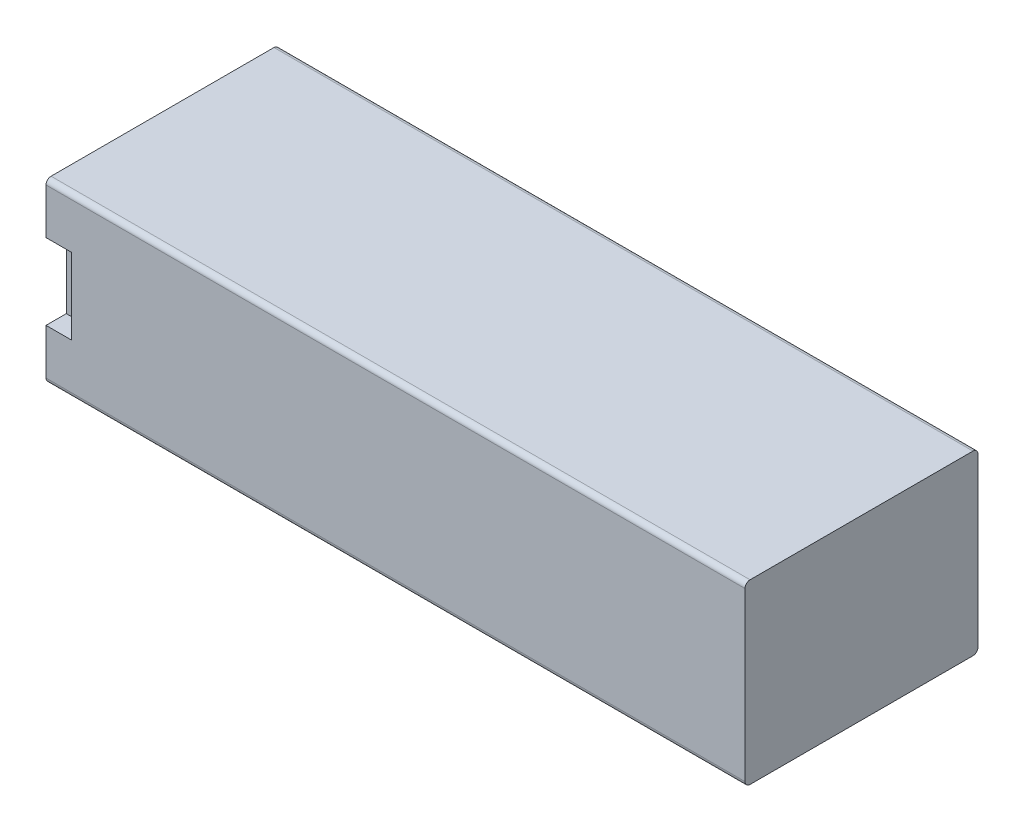
ISO-10303-21;
HEADER;
FILE_DESCRIPTION(('STEP AP214'),'2;1');
FILE_NAME('part.step','',(''),(''),'','','');
FILE_SCHEMA(('AUTOMOTIVE_DESIGN { 1 0 10303 214 1 1 1 1 }'));
ENDSEC;
DATA;
#1=APPLICATION_CONTEXT('core data for automotive mechanical design processes');
#2=APPLICATION_PROTOCOL_DEFINITION('international standard','automotive_design',2000,#1);
#3=PRODUCT_CONTEXT('',#1,'mechanical');
#4=PRODUCT('Part','Part','',(#3));
#5=PRODUCT_RELATED_PRODUCT_CATEGORY('part','',(#4));
#6=PRODUCT_DEFINITION_FORMATION('','',#4);
#7=PRODUCT_DEFINITION_CONTEXT('part definition',#1,'design');
#8=PRODUCT_DEFINITION('design','',#6,#7);
#9=PRODUCT_DEFINITION_SHAPE('','',#8);
#10=(LENGTH_UNIT() NAMED_UNIT(*) SI_UNIT(.MILLI.,.METRE.));
#11=(NAMED_UNIT(*) PLANE_ANGLE_UNIT() SI_UNIT($,.RADIAN.));
#12=(NAMED_UNIT(*) SI_UNIT($,.STERADIAN.) SOLID_ANGLE_UNIT());
#13=UNCERTAINTY_MEASURE_WITH_UNIT(LENGTH_MEASURE(1.E-05),#10,'distance_accuracy_value','');
#14=(GEOMETRIC_REPRESENTATION_CONTEXT(3) GLOBAL_UNCERTAINTY_ASSIGNED_CONTEXT((#13)) GLOBAL_UNIT_ASSIGNED_CONTEXT((#10,
#11,#12)) REPRESENTATION_CONTEXT('',''));
#15=CARTESIAN_POINT('',(0.,0.,0.));
#16=DIRECTION('',(0.,0.,1.));
#17=DIRECTION('',(1.,0.,0.));
#18=AXIS2_PLACEMENT_3D('',#15,#16,#17);
#19=CARTESIAN_POINT('',(0.,0.,-46.));
#20=DIRECTION('',(-1.,0.,0.));
#21=DIRECTION('',(0.,0.,1.));
#22=AXIS2_PLACEMENT_3D('',#19,#20,#21);
#23=PLANE('',#22);
#24=DIRECTION('',(0.,0.,1.));
#25=VECTOR('',#24,1.);
#26=CARTESIAN_POINT('',(0.,10.,0.));
#27=LINE('',#26,#25);
#28=CARTESIAN_POINT('',(0.,10.,-4.));
#29=VERTEX_POINT('',#28);
#30=CARTESIAN_POINT('',(0.,10.,0.));
#31=VERTEX_POINT('',#30);
#32=EDGE_CURVE('E150',#29,#31,#27,.T.);
#33=ORIENTED_EDGE('',*,*,#32,.F.);
#34=DIRECTION('',(0.,-1.,0.));
#35=VECTOR('',#34,1.);
#36=CARTESIAN_POINT('',(0.,25.,-4.));
#37=LINE('',#36,#35);
#38=CARTESIAN_POINT('',(0.,25.,-4.));
#39=VERTEX_POINT('',#38);
#40=EDGE_CURVE('E233',#39,#29,#37,.T.);
#41=ORIENTED_EDGE('',*,*,#40,.F.);
#42=DIRECTION('',(0.,0.,-1.));
#43=VECTOR('',#42,1.);
#44=CARTESIAN_POINT('',(0.,25.,0.));
#45=LINE('',#44,#43);
#46=CARTESIAN_POINT('',(0.,25.,0.));
#47=VERTEX_POINT('',#46);
#48=EDGE_CURVE('E236',#47,#39,#45,.T.);
#49=ORIENTED_EDGE('',*,*,#48,.F.);
#50=DIRECTION('',(0.,-1.,0.));
#51=VECTOR('',#50,1.);
#52=CARTESIAN_POINT('',(0.,0.,0.));
#53=LINE('',#52,#51);
#54=CARTESIAN_POINT('',(0.,34.,0.));
#55=VERTEX_POINT('',#54);
#56=EDGE_CURVE('E156',#55,#47,#53,.T.);
#57=ORIENTED_EDGE('',*,*,#56,.F.);
#58=CARTESIAN_POINT('',(0.,34.,-1.));
#59=DIRECTION('',(-1.,0.,0.));
#60=DIRECTION('',(0.,0.,1.));
#61=AXIS2_PLACEMENT_3D('',#58,#59,#60);
#62=CIRCLE('',#61,1.);
#63=CARTESIAN_POINT('',(0.,35.,-1.));
#64=VERTEX_POINT('',#63);
#65=EDGE_CURVE('E204',#55,#64,#62,.T.);
#66=ORIENTED_EDGE('',*,*,#65,.T.);
#67=DIRECTION('',(0.,0.,1.));
#68=VECTOR('',#67,1.);
#69=CARTESIAN_POINT('',(0.,35.,-46.));
#70=LINE('',#69,#68);
#71=CARTESIAN_POINT('',(0.,35.,-45.));
#72=VERTEX_POINT('',#71);
#73=EDGE_CURVE('E176',#72,#64,#70,.T.);
#74=ORIENTED_EDGE('',*,*,#73,.F.);
#75=CARTESIAN_POINT('',(0.,34.,-45.));
#76=DIRECTION('',(-1.,0.,0.));
#77=DIRECTION('',(0.,0.,1.));
#78=AXIS2_PLACEMENT_3D('',#75,#76,#77);
#79=CIRCLE('',#78,1.);
#80=CARTESIAN_POINT('',(0.,34.,-46.));
#81=VERTEX_POINT('',#80);
#82=EDGE_CURVE('E206',#72,#81,#79,.T.);
#83=ORIENTED_EDGE('',*,*,#82,.T.);
#84=DIRECTION('',(0.,-1.,0.));
#85=VECTOR('',#84,1.);
#86=CARTESIAN_POINT('',(0.,0.,-46.));
#87=LINE('',#86,#85);
#88=CARTESIAN_POINT('',(0.,1.,-46.));
#89=VERTEX_POINT('',#88);
#90=EDGE_CURVE('E164',#81,#89,#87,.T.);
#91=ORIENTED_EDGE('',*,*,#90,.T.);
#92=CARTESIAN_POINT('',(0.,1.,-45.));
#93=DIRECTION('',(-1.,0.,0.));
#94=DIRECTION('',(0.,0.,1.));
#95=AXIS2_PLACEMENT_3D('',#92,#93,#94);
#96=CIRCLE('',#95,1.);
#97=CARTESIAN_POINT('',(0.,0.,-45.));
#98=VERTEX_POINT('',#97);
#99=EDGE_CURVE('E211',#89,#98,#96,.T.);
#100=ORIENTED_EDGE('',*,*,#99,.T.);
#101=DIRECTION('',(0.,0.,1.));
#102=VECTOR('',#101,1.);
#103=CARTESIAN_POINT('',(0.,0.,-46.));
#104=LINE('',#103,#102);
#105=CARTESIAN_POINT('',(0.,0.,-1.));
#106=VERTEX_POINT('',#105);
#107=EDGE_CURVE('E171',#98,#106,#104,.T.);
#108=ORIENTED_EDGE('',*,*,#107,.T.);
#109=CARTESIAN_POINT('',(0.,1.,-1.));
#110=DIRECTION('',(-1.,0.,0.));
#111=DIRECTION('',(0.,0.,1.));
#112=AXIS2_PLACEMENT_3D('',#109,#110,#111);
#113=CIRCLE('',#112,1.);
#114=CARTESIAN_POINT('',(0.,1.,0.));
#115=VERTEX_POINT('',#114);
#116=EDGE_CURVE('E208',#106,#115,#113,.T.);
#117=ORIENTED_EDGE('',*,*,#116,.T.);
#118=EDGE_CURVE('E173',#31,#115,#53,.T.);
#119=ORIENTED_EDGE('',*,*,#118,.F.);
#120=EDGE_LOOP('',(#33,#41,#49,#57,#66,#74,#83,#91,#100,#108,#117,#119));
#121=FACE_BOUND('',#120,.T.);
#122=ADVANCED_FACE('F39',(#121),#23,.T.);
#123=CARTESIAN_POINT('',(0.,35.,-46.));
#124=DIRECTION('',(0.,1.,0.));
#125=DIRECTION('',(0.,0.,1.));
#126=AXIS2_PLACEMENT_3D('',#123,#124,#125);
#127=PLANE('',#126);
#128=DIRECTION('',(0.,0.,1.));
#129=VECTOR('',#128,1.);
#130=CARTESIAN_POINT('',(138.,35.,-46.));
#131=LINE('',#130,#129);
#132=CARTESIAN_POINT('',(138.,35.,-45.));
#133=VERTEX_POINT('',#132);
#134=CARTESIAN_POINT('',(138.,35.,-1.));
#135=VERTEX_POINT('',#134);
#136=EDGE_CURVE('E180',#133,#135,#131,.T.);
#137=ORIENTED_EDGE('',*,*,#136,.F.);
#138=DIRECTION('',(-1.,0.,0.));
#139=VECTOR('',#138,1.);
#140=CARTESIAN_POINT('',(0.,35.,-45.));
#141=LINE('',#140,#139);
#142=EDGE_CURVE('E220',#133,#72,#141,.T.);
#143=ORIENTED_EDGE('',*,*,#142,.T.);
#144=ORIENTED_EDGE('',*,*,#73,.T.);
#145=DIRECTION('',(-1.,0.,0.));
#146=VECTOR('',#145,1.);
#147=CARTESIAN_POINT('',(138.,35.,-1.));
#148=LINE('',#147,#146);
#149=EDGE_CURVE('E218',#64,#135,#148,.F.);
#150=ORIENTED_EDGE('',*,*,#149,.T.);
#151=EDGE_LOOP('',(#137,#143,#144,#150));
#152=FACE_BOUND('',#151,.T.);
#153=ADVANCED_FACE('F246',(#152),#127,.T.);
#154=CARTESIAN_POINT('',(138.,0.,-46.));
#155=DIRECTION('',(1.,0.,0.));
#156=DIRECTION('',(0.,0.,-1.));
#157=AXIS2_PLACEMENT_3D('',#154,#155,#156);
#158=PLANE('',#157);
#159=DIRECTION('',(0.,0.,1.));
#160=VECTOR('',#159,1.);
#161=CARTESIAN_POINT('',(138.,0.,-46.));
#162=LINE('',#161,#160);
#163=CARTESIAN_POINT('',(138.,0.,-45.));
#164=VERTEX_POINT('',#163);
#165=CARTESIAN_POINT('',(138.,0.,-1.));
#166=VERTEX_POINT('',#165);
#167=EDGE_CURVE('E183',#164,#166,#162,.T.);
#168=ORIENTED_EDGE('',*,*,#167,.F.);
#169=CARTESIAN_POINT('',(138.,1.,-45.));
#170=DIRECTION('',(1.,0.,0.));
#171=DIRECTION('',(0.,0.,-1.));
#172=AXIS2_PLACEMENT_3D('',#169,#170,#171);
#173=CIRCLE('',#172,1.);
#174=CARTESIAN_POINT('',(138.,1.,-46.));
#175=VERTEX_POINT('',#174);
#176=EDGE_CURVE('E198',#164,#175,#173,.T.);
#177=ORIENTED_EDGE('',*,*,#176,.T.);
#178=DIRECTION('',(0.,1.,0.));
#179=VECTOR('',#178,1.);
#180=CARTESIAN_POINT('',(138.,0.,-46.));
#181=LINE('',#180,#179);
#182=CARTESIAN_POINT('',(138.,34.,-46.));
#183=VERTEX_POINT('',#182);
#184=EDGE_CURVE('E167',#175,#183,#181,.T.);
#185=ORIENTED_EDGE('',*,*,#184,.T.);
#186=CARTESIAN_POINT('',(138.,34.,-45.));
#187=DIRECTION('',(1.,0.,0.));
#188=DIRECTION('',(0.,0.,-1.));
#189=AXIS2_PLACEMENT_3D('',#186,#187,#188);
#190=CIRCLE('',#189,1.);
#191=EDGE_CURVE('E194',#183,#133,#190,.T.);
#192=ORIENTED_EDGE('',*,*,#191,.T.);
#193=ORIENTED_EDGE('',*,*,#136,.T.);
#194=CARTESIAN_POINT('',(138.,34.,-1.));
#195=DIRECTION('',(1.,0.,0.));
#196=DIRECTION('',(0.,0.,-1.));
#197=AXIS2_PLACEMENT_3D('',#194,#195,#196);
#198=CIRCLE('',#197,1.);
#199=CARTESIAN_POINT('',(138.,34.,0.));
#200=VERTEX_POINT('',#199);
#201=EDGE_CURVE('E192',#135,#200,#198,.T.);
#202=ORIENTED_EDGE('',*,*,#201,.T.);
#203=DIRECTION('',(0.,1.,0.));
#204=VECTOR('',#203,1.);
#205=CARTESIAN_POINT('',(138.,0.,0.));
#206=LINE('',#205,#204);
#207=CARTESIAN_POINT('',(138.,1.,0.));
#208=VERTEX_POINT('',#207);
#209=EDGE_CURVE('E168',#208,#200,#206,.T.);
#210=ORIENTED_EDGE('',*,*,#209,.F.);
#211=CARTESIAN_POINT('',(138.,1.,-1.));
#212=DIRECTION('',(1.,0.,0.));
#213=DIRECTION('',(0.,0.,-1.));
#214=AXIS2_PLACEMENT_3D('',#211,#212,#213);
#215=CIRCLE('',#214,1.);
#216=EDGE_CURVE('E196',#208,#166,#215,.T.);
#217=ORIENTED_EDGE('',*,*,#216,.T.);
#218=EDGE_LOOP('',(#168,#177,#185,#192,#193,#202,#210,#217));
#219=FACE_BOUND('',#218,.T.);
#220=ADVANCED_FACE('F251',(#219),#158,.T.);
#221=CARTESIAN_POINT('',(0.,0.,-46.));
#222=DIRECTION('',(0.,-1.,0.));
#223=DIRECTION('',(0.,0.,-1.));
#224=AXIS2_PLACEMENT_3D('',#221,#222,#223);
#225=PLANE('',#224);
#226=ORIENTED_EDGE('',*,*,#107,.F.);
#227=DIRECTION('',(1.,0.,0.));
#228=VECTOR('',#227,1.);
#229=CARTESIAN_POINT('',(0.,0.,-45.));
#230=LINE('',#229,#228);
#231=EDGE_CURVE('E189',#98,#164,#230,.T.);
#232=ORIENTED_EDGE('',*,*,#231,.T.);
#233=ORIENTED_EDGE('',*,*,#167,.T.);
#234=DIRECTION('',(1.,0.,0.));
#235=VECTOR('',#234,1.);
#236=CARTESIAN_POINT('',(0.,0.,-1.));
#237=LINE('',#236,#235);
#238=EDGE_CURVE('E179',#166,#106,#237,.F.);
#239=ORIENTED_EDGE('',*,*,#238,.T.);
#240=EDGE_LOOP('',(#226,#232,#233,#239));
#241=FACE_BOUND('',#240,.T.);
#242=ADVANCED_FACE('F256',(#241),#225,.T.);
#243=CARTESIAN_POINT('',(0.,0.,-46.));
#244=DIRECTION('',(0.,0.,-1.));
#245=DIRECTION('',(-1.,0.,0.));
#246=AXIS2_PLACEMENT_3D('',#243,#244,#245);
#247=PLANE('',#246);
#248=ORIENTED_EDGE('',*,*,#184,.F.);
#249=DIRECTION('',(1.,0.,0.));
#250=VECTOR('',#249,1.);
#251=CARTESIAN_POINT('',(0.,1.,-46.));
#252=LINE('',#251,#250);
#253=EDGE_CURVE('E202',#175,#89,#252,.F.);
#254=ORIENTED_EDGE('',*,*,#253,.T.);
#255=ORIENTED_EDGE('',*,*,#90,.F.);
#256=DIRECTION('',(-1.,0.,0.));
#257=VECTOR('',#256,1.);
#258=CARTESIAN_POINT('',(0.,34.,-46.));
#259=LINE('',#258,#257);
#260=EDGE_CURVE('E200',#81,#183,#259,.F.);
#261=ORIENTED_EDGE('',*,*,#260,.T.);
#262=EDGE_LOOP('',(#248,#254,#255,#261));
#263=FACE_BOUND('',#262,.T.);
#264=ADVANCED_FACE('F294',(#263),#247,.T.);
#265=CARTESIAN_POINT('',(0.,0.,0.));
#266=DIRECTION('',(0.,0.,-1.));
#267=DIRECTION('',(-1.,0.,0.));
#268=AXIS2_PLACEMENT_3D('',#265,#266,#267);
#269=PLANE('',#268);
#270=DIRECTION('',(0.,1.,0.));
#271=VECTOR('',#270,1.);
#272=CARTESIAN_POINT('',(5.,25.,0.));
#273=LINE('',#272,#271);
#274=CARTESIAN_POINT('',(5.,10.,0.));
#275=VERTEX_POINT('',#274);
#276=CARTESIAN_POINT('',(5.,25.,0.));
#277=VERTEX_POINT('',#276);
#278=EDGE_CURVE('E143',#275,#277,#273,.T.);
#279=ORIENTED_EDGE('',*,*,#278,.F.);
#280=DIRECTION('',(-1.,0.,0.));
#281=VECTOR('',#280,1.);
#282=CARTESIAN_POINT('',(5.,10.,0.));
#283=LINE('',#282,#281);
#284=EDGE_CURVE('E227',#275,#31,#283,.T.);
#285=ORIENTED_EDGE('',*,*,#284,.T.);
#286=ORIENTED_EDGE('',*,*,#118,.T.);
#287=DIRECTION('',(1.,0.,0.));
#288=VECTOR('',#287,1.);
#289=CARTESIAN_POINT('',(138.,1.,0.));
#290=LINE('',#289,#288);
#291=EDGE_CURVE('E215',#115,#208,#290,.T.);
#292=ORIENTED_EDGE('',*,*,#291,.T.);
#293=ORIENTED_EDGE('',*,*,#209,.T.);
#294=DIRECTION('',(-1.,0.,0.));
#295=VECTOR('',#294,1.);
#296=CARTESIAN_POINT('',(0.,34.,0.));
#297=LINE('',#296,#295);
#298=EDGE_CURVE('E213',#200,#55,#297,.T.);
#299=ORIENTED_EDGE('',*,*,#298,.T.);
#300=ORIENTED_EDGE('',*,*,#56,.T.);
#301=DIRECTION('',(-1.,0.,0.));
#302=VECTOR('',#301,1.);
#303=CARTESIAN_POINT('',(5.,25.,0.));
#304=LINE('',#303,#302);
#305=EDGE_CURVE('E136',#277,#47,#304,.T.);
#306=ORIENTED_EDGE('',*,*,#305,.F.);
#307=EDGE_LOOP('',(#279,#285,#286,#292,#293,#299,#300,#306));
#308=FACE_BOUND('',#307,.T.);
#309=ADVANCED_FACE('F153',(#308),#269,.F.);
#310=CARTESIAN_POINT('',(0.,1.,-45.));
#311=DIRECTION('',(1.,0.,0.));
#312=DIRECTION('',(0.,0.,-1.));
#313=AXIS2_PLACEMENT_3D('',#310,#311,#312);
#314=CYLINDRICAL_SURFACE('',#313,1.);
#315=ORIENTED_EDGE('',*,*,#99,.F.);
#316=ORIENTED_EDGE('',*,*,#253,.F.);
#317=ORIENTED_EDGE('',*,*,#176,.F.);
#318=ORIENTED_EDGE('',*,*,#231,.F.);
#319=EDGE_LOOP('',(#315,#316,#317,#318));
#320=FACE_BOUND('',#319,.T.);
#321=ADVANCED_FACE('F258',(#320),#314,.T.);
#322=CARTESIAN_POINT('',(0.,1.,-1.));
#323=DIRECTION('',(-1.,0.,0.));
#324=DIRECTION('',(0.,0.,1.));
#325=AXIS2_PLACEMENT_3D('',#322,#323,#324);
#326=CYLINDRICAL_SURFACE('',#325,1.);
#327=ORIENTED_EDGE('',*,*,#116,.F.);
#328=ORIENTED_EDGE('',*,*,#238,.F.);
#329=ORIENTED_EDGE('',*,*,#216,.F.);
#330=ORIENTED_EDGE('',*,*,#291,.F.);
#331=EDGE_LOOP('',(#327,#328,#329,#330));
#332=FACE_BOUND('',#331,.T.);
#333=ADVANCED_FACE('F261',(#332),#326,.T.);
#334=CARTESIAN_POINT('',(0.,34.,-45.));
#335=DIRECTION('',(-1.,0.,0.));
#336=DIRECTION('',(0.,0.,1.));
#337=AXIS2_PLACEMENT_3D('',#334,#335,#336);
#338=CYLINDRICAL_SURFACE('',#337,1.);
#339=ORIENTED_EDGE('',*,*,#191,.F.);
#340=ORIENTED_EDGE('',*,*,#260,.F.);
#341=ORIENTED_EDGE('',*,*,#82,.F.);
#342=ORIENTED_EDGE('',*,*,#142,.F.);
#343=EDGE_LOOP('',(#339,#340,#341,#342));
#344=FACE_BOUND('',#343,.T.);
#345=ADVANCED_FACE('F265',(#344),#338,.T.);
#346=CARTESIAN_POINT('',(0.,34.,-1.));
#347=DIRECTION('',(1.,0.,0.));
#348=DIRECTION('',(0.,0.,-1.));
#349=AXIS2_PLACEMENT_3D('',#346,#347,#348);
#350=CYLINDRICAL_SURFACE('',#349,1.);
#351=ORIENTED_EDGE('',*,*,#201,.F.);
#352=ORIENTED_EDGE('',*,*,#149,.F.);
#353=ORIENTED_EDGE('',*,*,#65,.F.);
#354=ORIENTED_EDGE('',*,*,#298,.F.);
#355=EDGE_LOOP('',(#351,#352,#353,#354));
#356=FACE_BOUND('',#355,.T.);
#357=ADVANCED_FACE('F268',(#356),#350,.T.);
#358=CARTESIAN_POINT('',(5.,10.,0.));
#359=DIRECTION('',(0.,-1.,0.));
#360=DIRECTION('',(0.,0.,-1.));
#361=AXIS2_PLACEMENT_3D('',#358,#359,#360);
#362=PLANE('',#361);
#363=DIRECTION('',(0.,0.,1.));
#364=VECTOR('',#363,1.);
#365=CARTESIAN_POINT('',(5.,10.,0.));
#366=LINE('',#365,#364);
#367=CARTESIAN_POINT('',(5.,10.,-2.));
#368=VERTEX_POINT('',#367);
#369=EDGE_CURVE('E142',#368,#275,#366,.T.);
#370=ORIENTED_EDGE('',*,*,#369,.F.);
#371=CARTESIAN_POINT('',(3.,10.,-2.));
#372=DIRECTION('',(0.,-1.,0.));
#373=DIRECTION('',(0.,0.,-1.));
#374=AXIS2_PLACEMENT_3D('',#371,#372,#373);
#375=CIRCLE('',#374,2.);
#376=CARTESIAN_POINT('',(3.,10.,-4.));
#377=VERTEX_POINT('',#376);
#378=EDGE_CURVE('E61',#368,#377,#375,.F.);
#379=ORIENTED_EDGE('',*,*,#378,.T.);
#380=DIRECTION('',(-1.,0.,0.));
#381=VECTOR('',#380,1.);
#382=CARTESIAN_POINT('',(5.,10.,-4.));
#383=LINE('',#382,#381);
#384=EDGE_CURVE('E159',#377,#29,#383,.T.);
#385=ORIENTED_EDGE('',*,*,#384,.T.);
#386=ORIENTED_EDGE('',*,*,#32,.T.);
#387=ORIENTED_EDGE('',*,*,#284,.F.);
#388=EDGE_LOOP('',(#370,#379,#385,#386,#387));
#389=FACE_BOUND('',#388,.T.);
#390=ADVANCED_FACE('F226',(#389),#362,.F.);
#391=CARTESIAN_POINT('',(5.,25.,-4.));
#392=DIRECTION('',(0.,0.,-1.));
#393=DIRECTION('',(0.,1.,0.));
#394=AXIS2_PLACEMENT_3D('',#391,#392,#393);
#395=PLANE('',#394);
#396=ORIENTED_EDGE('',*,*,#384,.F.);
#397=DIRECTION('',(0.,-1.,0.));
#398=VECTOR('',#397,1.);
#399=CARTESIAN_POINT('',(3.,25.,-4.));
#400=LINE('',#399,#398);
#401=CARTESIAN_POINT('',(3.,25.,-4.));
#402=VERTEX_POINT('',#401);
#403=EDGE_CURVE('E47',#377,#402,#400,.F.);
#404=ORIENTED_EDGE('',*,*,#403,.T.);
#405=DIRECTION('',(-1.,0.,0.));
#406=VECTOR('',#405,1.);
#407=CARTESIAN_POINT('',(5.,25.,-4.));
#408=LINE('',#407,#406);
#409=EDGE_CURVE('E157',#402,#39,#408,.T.);
#410=ORIENTED_EDGE('',*,*,#409,.T.);
#411=ORIENTED_EDGE('',*,*,#40,.T.);
#412=EDGE_LOOP('',(#396,#404,#410,#411));
#413=FACE_BOUND('',#412,.T.);
#414=ADVANCED_FACE('F239',(#413),#395,.F.);
#415=CARTESIAN_POINT('',(5.,25.,0.));
#416=DIRECTION('',(0.,1.,0.));
#417=DIRECTION('',(0.,0.,1.));
#418=AXIS2_PLACEMENT_3D('',#415,#416,#417);
#419=PLANE('',#418);
#420=ORIENTED_EDGE('',*,*,#409,.F.);
#421=CARTESIAN_POINT('',(3.,25.,-2.));
#422=DIRECTION('',(0.,1.,0.));
#423=DIRECTION('',(0.,0.,1.));
#424=AXIS2_PLACEMENT_3D('',#421,#422,#423);
#425=CIRCLE('',#424,2.);
#426=CARTESIAN_POINT('',(5.,25.,-2.));
#427=VERTEX_POINT('',#426);
#428=EDGE_CURVE('E11',#402,#427,#425,.F.);
#429=ORIENTED_EDGE('',*,*,#428,.T.);
#430=DIRECTION('',(0.,0.,-1.));
#431=VECTOR('',#430,1.);
#432=CARTESIAN_POINT('',(5.,25.,0.));
#433=LINE('',#432,#431);
#434=EDGE_CURVE('E131',#277,#427,#433,.T.);
#435=ORIENTED_EDGE('',*,*,#434,.F.);
#436=ORIENTED_EDGE('',*,*,#305,.T.);
#437=ORIENTED_EDGE('',*,*,#48,.T.);
#438=EDGE_LOOP('',(#420,#429,#435,#436,#437));
#439=FACE_BOUND('',#438,.T.);
#440=ADVANCED_FACE('F133',(#439),#419,.F.);
#441=CARTESIAN_POINT('',(5.,0.,0.));
#442=DIRECTION('',(1.,0.,0.));
#443=DIRECTION('',(0.,0.,-1.));
#444=AXIS2_PLACEMENT_3D('',#441,#442,#443);
#445=PLANE('',#444);
#446=ORIENTED_EDGE('',*,*,#434,.T.);
#447=DIRECTION('',(0.,-1.,0.));
#448=VECTOR('',#447,1.);
#449=CARTESIAN_POINT('',(5.,10.,-2.));
#450=LINE('',#449,#448);
#451=EDGE_CURVE('E223',#427,#368,#450,.T.);
#452=ORIENTED_EDGE('',*,*,#451,.T.);
#453=ORIENTED_EDGE('',*,*,#369,.T.);
#454=ORIENTED_EDGE('',*,*,#278,.T.);
#455=EDGE_LOOP('',(#446,#452,#453,#454));
#456=FACE_BOUND('',#455,.T.);
#457=ADVANCED_FACE('F146',(#456),#445,.F.);
#458=CARTESIAN_POINT('',(3.,0.,-1.99999999999999));
#459=DIRECTION('',(0.,1.,0.));
#460=DIRECTION('',(0.,0.,1.));
#461=AXIS2_PLACEMENT_3D('',#458,#459,#460);
#462=CYLINDRICAL_SURFACE('',#461,2.);
#463=ORIENTED_EDGE('',*,*,#428,.F.);
#464=ORIENTED_EDGE('',*,*,#403,.F.);
#465=ORIENTED_EDGE('',*,*,#378,.F.);
#466=ORIENTED_EDGE('',*,*,#451,.F.);
#467=EDGE_LOOP('',(#463,#464,#465,#466));
#468=FACE_BOUND('',#467,.T.);
#469=ADVANCED_FACE('F41',(#468),#462,.F.);
#470=CLOSED_SHELL('',(#122,#153,#220,#242,#264,#309,#321,#333,#345,#357,#390,#414,#440,#457,#469));
#471=MANIFOLD_SOLID_BREP('B2',#470);
#472=ADVANCED_BREP_SHAPE_REPRESENTATION('',(#18,#471),#14);
#473=SHAPE_DEFINITION_REPRESENTATION(#9,#472);
ENDSEC;
END-ISO-10303-21;
